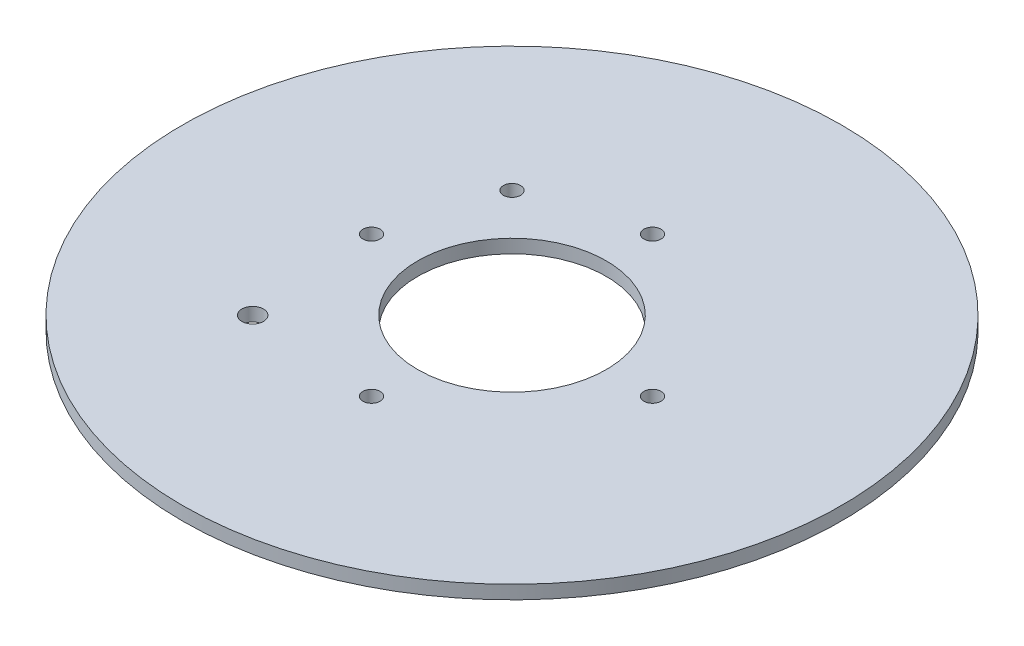
ISO-10303-21;
HEADER;
FILE_DESCRIPTION(('STEP AP214'),'2;1');
FILE_NAME('part.step','',(''),(''),'','','');
FILE_SCHEMA(('AUTOMOTIVE_DESIGN { 1 0 10303 214 1 1 1 1 }'));
ENDSEC;
DATA;
#1=APPLICATION_CONTEXT('core data for automotive mechanical design processes');
#2=APPLICATION_PROTOCOL_DEFINITION('international standard','automotive_design',2000,#1);
#3=PRODUCT_CONTEXT('',#1,'mechanical');
#4=PRODUCT('Part','Part','',(#3));
#5=PRODUCT_RELATED_PRODUCT_CATEGORY('part','',(#4));
#6=PRODUCT_DEFINITION_FORMATION('','',#4);
#7=PRODUCT_DEFINITION_CONTEXT('part definition',#1,'design');
#8=PRODUCT_DEFINITION('design','',#6,#7);
#9=PRODUCT_DEFINITION_SHAPE('','',#8);
#10=(LENGTH_UNIT() NAMED_UNIT(*) SI_UNIT(.MILLI.,.METRE.));
#11=(NAMED_UNIT(*) PLANE_ANGLE_UNIT() SI_UNIT($,.RADIAN.));
#12=(NAMED_UNIT(*) SI_UNIT($,.STERADIAN.) SOLID_ANGLE_UNIT());
#13=UNCERTAINTY_MEASURE_WITH_UNIT(LENGTH_MEASURE(1.E-05),#10,'distance_accuracy_value','');
#14=(GEOMETRIC_REPRESENTATION_CONTEXT(3) GLOBAL_UNCERTAINTY_ASSIGNED_CONTEXT((#13)) GLOBAL_UNIT_ASSIGNED_CONTEXT((#10,
#11,#12)) REPRESENTATION_CONTEXT('',''));
#15=CARTESIAN_POINT('',(0.,0.,0.));
#16=DIRECTION('',(0.,0.,1.));
#17=DIRECTION('',(1.,0.,0.));
#18=AXIS2_PLACEMENT_3D('',#15,#16,#17);
#19=CARTESIAN_POINT('',(0.,3.175,0.));
#20=DIRECTION('',(0.,-1.,0.));
#21=DIRECTION('',(0.,0.,-1.));
#22=AXIS2_PLACEMENT_3D('',#19,#20,#21);
#23=CYLINDRICAL_SURFACE('',#22,77.4600051);
#24=CARTESIAN_POINT('',(0.,3.175,0.));
#25=DIRECTION('',(0.,1.,0.));
#26=DIRECTION('',(0.,0.,1.));
#27=AXIS2_PLACEMENT_3D('',#24,#25,#26);
#28=CIRCLE('',#27,77.4600051);
#29=CARTESIAN_POINT('',(0.,3.175,77.4600051));
#30=VERTEX_POINT('',#29);
#31=EDGE_CURVE('E10',#30,#30,#28,.T.);
#32=ORIENTED_EDGE('',*,*,#31,.F.);
#33=EDGE_LOOP('',(#32));
#34=FACE_BOUND('',#33,.T.);
#35=CARTESIAN_POINT('',(0.,0.,0.));
#36=DIRECTION('',(0.,1.,0.));
#37=DIRECTION('',(0.,0.,1.));
#38=AXIS2_PLACEMENT_3D('',#35,#36,#37);
#39=CIRCLE('',#38,77.4600051);
#40=CARTESIAN_POINT('',(0.,0.,77.4600051));
#41=VERTEX_POINT('',#40);
#42=EDGE_CURVE('E36',#41,#41,#39,.T.);
#43=ORIENTED_EDGE('',*,*,#42,.T.);
#44=EDGE_LOOP('',(#43));
#45=FACE_BOUND('',#44,.T.);
#46=ADVANCED_FACE('F33',(#34,#45),#23,.T.);
#47=CARTESIAN_POINT('',(0.,3.175,0.));
#48=DIRECTION('',(0.,1.,0.));
#49=DIRECTION('',(0.,0.,1.));
#50=AXIS2_PLACEMENT_3D('',#47,#48,#49);
#51=PLANE('',#50);
#52=CARTESIAN_POINT('',(-25.4,3.175,-25.4));
#53=DIRECTION('',(0.,1.,0.));
#54=DIRECTION('',(0.,0.,1.));
#55=AXIS2_PLACEMENT_3D('',#52,#53,#54);
#56=CIRCLE('',#55,2.0193);
#57=CARTESIAN_POINT('',(-25.4,3.175,-23.3807));
#58=VERTEX_POINT('',#57);
#59=EDGE_CURVE('E69',#58,#58,#56,.T.);
#60=ORIENTED_EDGE('',*,*,#59,.F.);
#61=EDGE_LOOP('',(#60));
#62=FACE_BOUND('',#61,.T.);
#63=CARTESIAN_POINT('',(-33.02,3.175,0.));
#64=DIRECTION('',(0.,1.,0.));
#65=DIRECTION('',(0.,0.,1.));
#66=AXIS2_PLACEMENT_3D('',#63,#64,#65);
#67=CIRCLE('',#66,2.0193);
#68=CARTESIAN_POINT('',(-33.02,3.175,2.0193));
#69=VERTEX_POINT('',#68);
#70=EDGE_CURVE('E75',#69,#69,#67,.T.);
#71=ORIENTED_EDGE('',*,*,#70,.F.);
#72=EDGE_LOOP('',(#71));
#73=FACE_BOUND('',#72,.T.);
#74=CARTESIAN_POINT('',(0.,3.175,-33.02));
#75=DIRECTION('',(0.,1.,0.));
#76=DIRECTION('',(0.,0.,1.));
#77=AXIS2_PLACEMENT_3D('',#74,#75,#76);
#78=CIRCLE('',#77,2.0193);
#79=CARTESIAN_POINT('',(0.,3.175,-31.0007));
#80=VERTEX_POINT('',#79);
#81=EDGE_CURVE('E81',#80,#80,#78,.T.);
#82=ORIENTED_EDGE('',*,*,#81,.F.);
#83=EDGE_LOOP('',(#82));
#84=FACE_BOUND('',#83,.T.);
#85=CARTESIAN_POINT('',(33.02,3.175,0.));
#86=DIRECTION('',(0.,1.,0.));
#87=DIRECTION('',(0.,0.,1.));
#88=AXIS2_PLACEMENT_3D('',#85,#86,#87);
#89=CIRCLE('',#88,2.0193);
#90=CARTESIAN_POINT('',(33.02,3.175,2.0193));
#91=VERTEX_POINT('',#90);
#92=EDGE_CURVE('E51',#91,#91,#89,.T.);
#93=ORIENTED_EDGE('',*,*,#92,.F.);
#94=EDGE_LOOP('',(#93));
#95=FACE_BOUND('',#94,.T.);
#96=CARTESIAN_POINT('',(0.,3.175,33.02));
#97=DIRECTION('',(0.,1.,0.));
#98=DIRECTION('',(0.,0.,1.));
#99=AXIS2_PLACEMENT_3D('',#96,#97,#98);
#100=CIRCLE('',#99,2.0193);
#101=CARTESIAN_POINT('',(0.,3.175,35.0393));
#102=VERTEX_POINT('',#101);
#103=EDGE_CURVE('E58',#102,#102,#100,.T.);
#104=ORIENTED_EDGE('',*,*,#103,.F.);
#105=EDGE_LOOP('',(#104));
#106=FACE_BOUND('',#105,.T.);
#107=CARTESIAN_POINT('',(-30.48,3.175,30.48));
#108=DIRECTION('',(0.,1.,0.));
#109=DIRECTION('',(0.,0.,1.));
#110=AXIS2_PLACEMENT_3D('',#107,#108,#109);
#111=CIRCLE('',#110,2.54);
#112=CARTESIAN_POINT('',(-30.48,3.175,33.02));
#113=VERTEX_POINT('',#112);
#114=EDGE_CURVE('E64',#113,#113,#111,.T.);
#115=ORIENTED_EDGE('',*,*,#114,.F.);
#116=EDGE_LOOP('',(#115));
#117=FACE_BOUND('',#116,.T.);
#118=CARTESIAN_POINT('',(0.,3.175,0.));
#119=DIRECTION('',(0.,1.,0.));
#120=DIRECTION('',(0.,0.,1.));
#121=AXIS2_PLACEMENT_3D('',#118,#119,#120);
#122=CIRCLE('',#121,22.1615);
#123=CARTESIAN_POINT('',(0.,3.175,22.1615));
#124=VERTEX_POINT('',#123);
#125=EDGE_CURVE('E45',#124,#124,#122,.T.);
#126=ORIENTED_EDGE('',*,*,#125,.F.);
#127=EDGE_LOOP('',(#126));
#128=FACE_BOUND('',#127,.T.);
#129=ORIENTED_EDGE('',*,*,#31,.T.);
#130=EDGE_LOOP('',(#129));
#131=FACE_BOUND('',#130,.T.);
#132=ADVANCED_FACE('F98',(#62,#73,#84,#95,#106,#117,#128,#131),#51,.T.);
#133=CARTESIAN_POINT('',(0.,0.,0.));
#134=DIRECTION('',(0.,1.,0.));
#135=DIRECTION('',(0.,0.,1.));
#136=AXIS2_PLACEMENT_3D('',#133,#134,#135);
#137=PLANE('',#136);
#138=CARTESIAN_POINT('',(-25.4,0.,-25.4));
#139=DIRECTION('',(0.,1.,0.));
#140=DIRECTION('',(0.,0.,1.));
#141=AXIS2_PLACEMENT_3D('',#138,#139,#140);
#142=CIRCLE('',#141,2.0193);
#143=CARTESIAN_POINT('',(-25.4,0.,-23.3807));
#144=VERTEX_POINT('',#143);
#145=EDGE_CURVE('E72',#144,#144,#142,.T.);
#146=ORIENTED_EDGE('',*,*,#145,.T.);
#147=EDGE_LOOP('',(#146));
#148=FACE_BOUND('',#147,.T.);
#149=CARTESIAN_POINT('',(-33.02,0.,0.));
#150=DIRECTION('',(0.,1.,0.));
#151=DIRECTION('',(0.,0.,1.));
#152=AXIS2_PLACEMENT_3D('',#149,#150,#151);
#153=CIRCLE('',#152,2.0193);
#154=CARTESIAN_POINT('',(-33.02,0.,2.0193));
#155=VERTEX_POINT('',#154);
#156=EDGE_CURVE('E78',#155,#155,#153,.T.);
#157=ORIENTED_EDGE('',*,*,#156,.T.);
#158=EDGE_LOOP('',(#157));
#159=FACE_BOUND('',#158,.T.);
#160=CARTESIAN_POINT('',(0.,0.,-33.02));
#161=DIRECTION('',(0.,1.,0.));
#162=DIRECTION('',(0.,0.,1.));
#163=AXIS2_PLACEMENT_3D('',#160,#161,#162);
#164=CIRCLE('',#163,2.0193);
#165=CARTESIAN_POINT('',(0.,0.,-31.0007));
#166=VERTEX_POINT('',#165);
#167=EDGE_CURVE('E55',#166,#166,#164,.T.);
#168=ORIENTED_EDGE('',*,*,#167,.T.);
#169=EDGE_LOOP('',(#168));
#170=FACE_BOUND('',#169,.T.);
#171=CARTESIAN_POINT('',(33.02,0.,0.));
#172=DIRECTION('',(0.,1.,0.));
#173=DIRECTION('',(0.,0.,1.));
#174=AXIS2_PLACEMENT_3D('',#171,#172,#173);
#175=CIRCLE('',#174,2.0193);
#176=CARTESIAN_POINT('',(33.02,0.,2.0193));
#177=VERTEX_POINT('',#176);
#178=EDGE_CURVE('E54',#177,#177,#175,.T.);
#179=ORIENTED_EDGE('',*,*,#178,.T.);
#180=EDGE_LOOP('',(#179));
#181=FACE_BOUND('',#180,.T.);
#182=CARTESIAN_POINT('',(0.,0.,33.02));
#183=DIRECTION('',(0.,1.,0.));
#184=DIRECTION('',(0.,0.,1.));
#185=AXIS2_PLACEMENT_3D('',#182,#183,#184);
#186=CIRCLE('',#185,2.0193);
#187=CARTESIAN_POINT('',(0.,0.,35.0393));
#188=VERTEX_POINT('',#187);
#189=EDGE_CURVE('E61',#188,#188,#186,.T.);
#190=ORIENTED_EDGE('',*,*,#189,.T.);
#191=EDGE_LOOP('',(#190));
#192=FACE_BOUND('',#191,.T.);
#193=CARTESIAN_POINT('',(-30.48,0.,30.48));
#194=DIRECTION('',(0.,1.,0.));
#195=DIRECTION('',(0.,0.,1.));
#196=AXIS2_PLACEMENT_3D('',#193,#194,#195);
#197=CIRCLE('',#196,2.54);
#198=CARTESIAN_POINT('',(-30.48,0.,33.02));
#199=VERTEX_POINT('',#198);
#200=EDGE_CURVE('E48',#199,#199,#197,.T.);
#201=ORIENTED_EDGE('',*,*,#200,.T.);
#202=EDGE_LOOP('',(#201));
#203=FACE_BOUND('',#202,.T.);
#204=CARTESIAN_POINT('',(0.,0.,0.));
#205=DIRECTION('',(0.,1.,0.));
#206=DIRECTION('',(0.,0.,1.));
#207=AXIS2_PLACEMENT_3D('',#204,#205,#206);
#208=CIRCLE('',#207,22.1615);
#209=CARTESIAN_POINT('',(0.,0.,22.1615));
#210=VERTEX_POINT('',#209);
#211=EDGE_CURVE('E43',#210,#210,#208,.T.);
#212=ORIENTED_EDGE('',*,*,#211,.T.);
#213=EDGE_LOOP('',(#212));
#214=FACE_BOUND('',#213,.T.);
#215=ORIENTED_EDGE('',*,*,#42,.F.);
#216=EDGE_LOOP('',(#215));
#217=FACE_BOUND('',#216,.T.);
#218=ADVANCED_FACE('F87',(#148,#159,#170,#181,#192,#203,#214,#217),#137,.F.);
#219=CARTESIAN_POINT('',(0.,0.,0.));
#220=DIRECTION('',(0.,1.,0.));
#221=DIRECTION('',(0.,0.,1.));
#222=AXIS2_PLACEMENT_3D('',#219,#220,#221);
#223=CYLINDRICAL_SURFACE('',#222,22.1615);
#224=ORIENTED_EDGE('',*,*,#211,.F.);
#225=EDGE_LOOP('',(#224));
#226=FACE_BOUND('',#225,.T.);
#227=ORIENTED_EDGE('',*,*,#125,.T.);
#228=EDGE_LOOP('',(#227));
#229=FACE_BOUND('',#228,.T.);
#230=ADVANCED_FACE('F111',(#226,#229),#223,.F.);
#231=CARTESIAN_POINT('',(-30.48,0.,30.48));
#232=DIRECTION('',(0.,1.,0.));
#233=DIRECTION('',(0.,0.,1.));
#234=AXIS2_PLACEMENT_3D('',#231,#232,#233);
#235=CYLINDRICAL_SURFACE('',#234,2.54);
#236=ORIENTED_EDGE('',*,*,#200,.F.);
#237=EDGE_LOOP('',(#236));
#238=FACE_BOUND('',#237,.T.);
#239=ORIENTED_EDGE('',*,*,#114,.T.);
#240=EDGE_LOOP('',(#239));
#241=FACE_BOUND('',#240,.T.);
#242=ADVANCED_FACE('F113',(#238,#241),#235,.F.);
#243=CARTESIAN_POINT('',(0.,0.,33.02));
#244=DIRECTION('',(0.,1.,0.));
#245=DIRECTION('',(0.,0.,1.));
#246=AXIS2_PLACEMENT_3D('',#243,#244,#245);
#247=CYLINDRICAL_SURFACE('',#246,2.0193);
#248=ORIENTED_EDGE('',*,*,#189,.F.);
#249=EDGE_LOOP('',(#248));
#250=FACE_BOUND('',#249,.T.);
#251=ORIENTED_EDGE('',*,*,#103,.T.);
#252=EDGE_LOOP('',(#251));
#253=FACE_BOUND('',#252,.T.);
#254=ADVANCED_FACE('F120',(#250,#253),#247,.F.);
#255=CARTESIAN_POINT('',(33.02,0.,0.));
#256=DIRECTION('',(0.,1.,0.));
#257=DIRECTION('',(0.,0.,1.));
#258=AXIS2_PLACEMENT_3D('',#255,#256,#257);
#259=CYLINDRICAL_SURFACE('',#258,2.0193);
#260=ORIENTED_EDGE('',*,*,#178,.F.);
#261=EDGE_LOOP('',(#260));
#262=FACE_BOUND('',#261,.T.);
#263=ORIENTED_EDGE('',*,*,#92,.T.);
#264=EDGE_LOOP('',(#263));
#265=FACE_BOUND('',#264,.T.);
#266=ADVANCED_FACE('F94',(#262,#265),#259,.F.);
#267=CARTESIAN_POINT('',(0.,0.,-33.02));
#268=DIRECTION('',(0.,1.,0.));
#269=DIRECTION('',(0.,0.,1.));
#270=AXIS2_PLACEMENT_3D('',#267,#268,#269);
#271=CYLINDRICAL_SURFACE('',#270,2.0193);
#272=ORIENTED_EDGE('',*,*,#167,.F.);
#273=EDGE_LOOP('',(#272));
#274=FACE_BOUND('',#273,.T.);
#275=ORIENTED_EDGE('',*,*,#81,.T.);
#276=EDGE_LOOP('',(#275));
#277=FACE_BOUND('',#276,.T.);
#278=ADVANCED_FACE('F90',(#274,#277),#271,.F.);
#279=CARTESIAN_POINT('',(-33.02,0.,0.));
#280=DIRECTION('',(0.,1.,0.));
#281=DIRECTION('',(0.,0.,1.));
#282=AXIS2_PLACEMENT_3D('',#279,#280,#281);
#283=CYLINDRICAL_SURFACE('',#282,2.0193);
#284=ORIENTED_EDGE('',*,*,#156,.F.);
#285=EDGE_LOOP('',(#284));
#286=FACE_BOUND('',#285,.T.);
#287=ORIENTED_EDGE('',*,*,#70,.T.);
#288=EDGE_LOOP('',(#287));
#289=FACE_BOUND('',#288,.T.);
#290=ADVANCED_FACE('F93',(#286,#289),#283,.F.);
#291=CARTESIAN_POINT('',(-25.4,0.,-25.4));
#292=DIRECTION('',(0.,1.,0.));
#293=DIRECTION('',(0.,0.,1.));
#294=AXIS2_PLACEMENT_3D('',#291,#292,#293);
#295=CYLINDRICAL_SURFACE('',#294,2.0193);
#296=ORIENTED_EDGE('',*,*,#145,.F.);
#297=EDGE_LOOP('',(#296));
#298=FACE_BOUND('',#297,.T.);
#299=ORIENTED_EDGE('',*,*,#59,.T.);
#300=EDGE_LOOP('',(#299));
#301=FACE_BOUND('',#300,.T.);
#302=ADVANCED_FACE('F183',(#298,#301),#295,.F.);
#303=CLOSED_SHELL('',(#46,#132,#218,#230,#242,#254,#266,#278,#290,#302));
#304=MANIFOLD_SOLID_BREP('B2',#303);
#305=ADVANCED_BREP_SHAPE_REPRESENTATION('',(#18,#304),#14);
#306=SHAPE_DEFINITION_REPRESENTATION(#9,#305);
ENDSEC;
END-ISO-10303-21;
